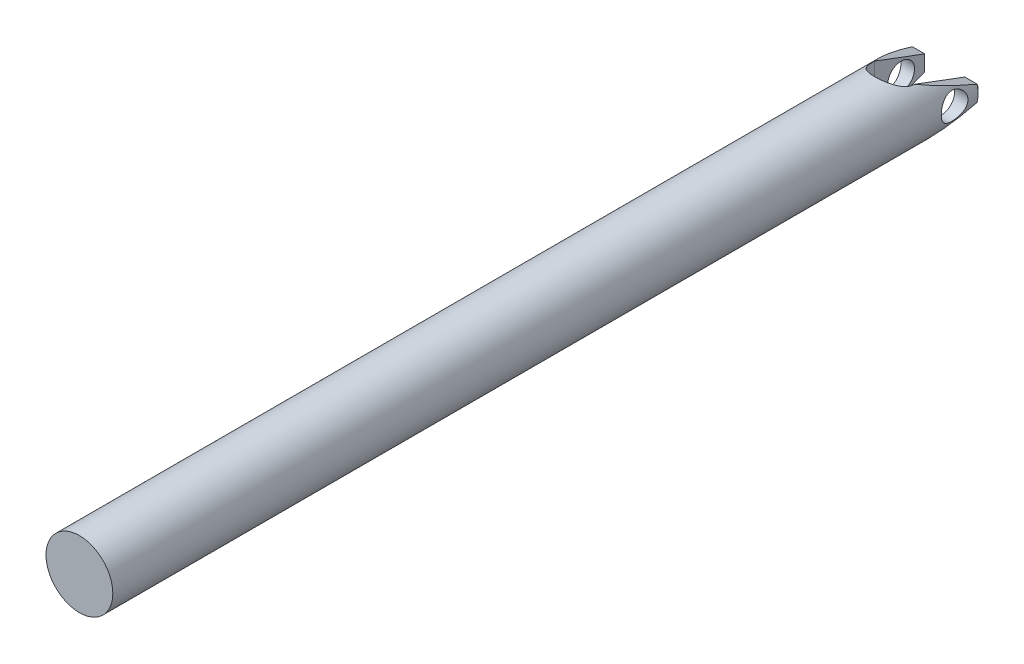
ISO-10303-21;
HEADER;
FILE_DESCRIPTION(('STEP AP214'),'2;1');
FILE_NAME('part.step','',(''),(''),'','','');
FILE_SCHEMA(('AUTOMOTIVE_DESIGN { 1 0 10303 214 1 1 1 1 }'));
ENDSEC;
DATA;
#1=APPLICATION_CONTEXT('core data for automotive mechanical design processes');
#2=APPLICATION_PROTOCOL_DEFINITION('international standard','automotive_design',2000,#1);
#3=PRODUCT_CONTEXT('',#1,'mechanical');
#4=PRODUCT('Part','Part','',(#3));
#5=PRODUCT_RELATED_PRODUCT_CATEGORY('part','',(#4));
#6=PRODUCT_DEFINITION_FORMATION('','',#4);
#7=PRODUCT_DEFINITION_CONTEXT('part definition',#1,'design');
#8=PRODUCT_DEFINITION('design','',#6,#7);
#9=PRODUCT_DEFINITION_SHAPE('','',#8);
#10=(LENGTH_UNIT() NAMED_UNIT(*) SI_UNIT(.MILLI.,.METRE.));
#11=(NAMED_UNIT(*) PLANE_ANGLE_UNIT() SI_UNIT($,.RADIAN.));
#12=(NAMED_UNIT(*) SI_UNIT($,.STERADIAN.) SOLID_ANGLE_UNIT());
#13=UNCERTAINTY_MEASURE_WITH_UNIT(LENGTH_MEASURE(1.E-05),#10,'distance_accuracy_value','');
#14=(GEOMETRIC_REPRESENTATION_CONTEXT(3) GLOBAL_UNCERTAINTY_ASSIGNED_CONTEXT((#13)) GLOBAL_UNIT_ASSIGNED_CONTEXT((#10,
#11,#12)) REPRESENTATION_CONTEXT('',''));
#15=CARTESIAN_POINT('',(0.,0.,0.));
#16=DIRECTION('',(0.,0.,1.));
#17=DIRECTION('',(1.,0.,0.));
#18=AXIS2_PLACEMENT_3D('',#15,#16,#17);
#19=CARTESIAN_POINT('',(0.,0.,0.));
#20=DIRECTION('',(0.,0.,1.));
#21=DIRECTION('',(1.,0.,0.));
#22=AXIS2_PLACEMENT_3D('',#19,#20,#21);
#23=PLANE('',#22);
#24=DIRECTION('',(0.,-1.,0.));
#25=VECTOR('',#24,1.);
#26=CARTESIAN_POINT('',(-3.5,0.,0.));
#27=LINE('',#26,#25);
#28=CARTESIAN_POINT('',(-3.5,0.5,0.));
#29=VERTEX_POINT('',#28);
#30=CARTESIAN_POINT('',(-3.5,-0.499999999999971,0.));
#31=VERTEX_POINT('',#30);
#32=EDGE_CURVE('E223',#29,#31,#27,.T.);
#33=ORIENTED_EDGE('',*,*,#32,.T.);
#34=DIRECTION('',(-1.,0.,0.));
#35=VECTOR('',#34,1.);
#36=CARTESIAN_POINT('',(0.,-0.499999999999971,0.));
#37=LINE('',#36,#35);
#38=CARTESIAN_POINT('',(-4.47213595499957,-0.499999999999971,0.));
#39=VERTEX_POINT('',#38);
#40=EDGE_CURVE('E225',#31,#39,#37,.T.);
#41=ORIENTED_EDGE('',*,*,#40,.T.);
#42=CARTESIAN_POINT('',(0.,0.,0.));
#43=DIRECTION('',(0.,0.,1.));
#44=DIRECTION('',(1.,0.,0.));
#45=AXIS2_PLACEMENT_3D('',#42,#43,#44);
#46=CIRCLE('',#45,4.49999999999999);
#47=CARTESIAN_POINT('',(-4.47213595499957,0.5,0.));
#48=VERTEX_POINT('',#47);
#49=EDGE_CURVE('E242',#39,#48,#46,.F.);
#50=ORIENTED_EDGE('',*,*,#49,.T.);
#51=DIRECTION('',(1.,0.,0.));
#52=VECTOR('',#51,1.);
#53=CARTESIAN_POINT('',(0.,0.5,0.));
#54=LINE('',#53,#52);
#55=EDGE_CURVE('E227',#48,#29,#54,.T.);
#56=ORIENTED_EDGE('',*,*,#55,.T.);
#57=EDGE_LOOP('',(#33,#41,#50,#56));
#58=FACE_BOUND('',#57,.T.);
#59=ADVANCED_FACE('F37',(#58),#23,.F.);
#60=CARTESIAN_POINT('',(0.,0.,130.));
#61=DIRECTION('',(0.,0.,-1.));
#62=DIRECTION('',(-1.,0.,0.));
#63=AXIS2_PLACEMENT_3D('',#60,#61,#62);
#64=CYLINDRICAL_SURFACE('',#63,5.);
#65=CARTESIAN_POINT('',(-5.,0.,2.));
#66=CARTESIAN_POINT('',(-4.99999271227085,0.107493005442891,2.00000985182373));
#67=CARTESIAN_POINT('',(-4.99649294306933,0.215172564090673,2.00871775208838));
#68=CARTESIAN_POINT('',(-4.98283453100642,0.427496480417895,2.04324770352124));
#69=CARTESIAN_POINT('',(-4.97265778698877,0.532131777561248,2.06911627908613));
#70=CARTESIAN_POINT('',(-4.94674209213119,0.734953922727402,2.13687607805883));
#71=CARTESIAN_POINT('',(-4.93102136364072,0.833160661616958,2.17871484621673));
#72=CARTESIAN_POINT('',(-4.89556610796078,1.02107197032837,2.27701917332655));
#73=CARTESIAN_POINT('',(-4.87583297458057,1.11077947675099,2.33347965491893));
#74=CARTESIAN_POINT('',(-4.83330886170419,1.28350100757039,2.46223549856094));
#75=CARTESIAN_POINT('',(-4.81042296929191,1.36606227255021,2.53510665624026));
#76=CARTESIAN_POINT('',(-4.76460576906195,1.51817500478472,2.69340000347678));
#77=CARTESIAN_POINT('',(-4.74167444453792,1.58772010713353,2.77882829721174));
#78=CARTESIAN_POINT('',(-4.69722791797136,1.71487456729288,2.96442807024227));
#79=CARTESIAN_POINT('',(-4.67582115964951,1.77181498119547,3.0650864860232));
#80=CARTESIAN_POINT('',(-4.63833647186793,1.86775471903715,3.27553639842004));
#81=CARTESIAN_POINT('',(-4.62225601244176,1.90676256428583,3.38532352784836));
#82=CARTESIAN_POINT('',(-4.59826357660819,1.96389882339587,3.6057123335921));
#83=CARTESIAN_POINT('',(-4.59001420355605,1.98289396580565,3.71605123557621));
#84=CARTESIAN_POINT('',(-4.58164004049144,2.00217296164003,3.93863499830727));
#85=CARTESIAN_POINT('',(-4.58151125522768,2.00246601631322,4.05087889462501));
#86=CARTESIAN_POINT('',(-4.58910500279994,1.98498936750454,4.26575667145804));
#87=CARTESIAN_POINT('',(-4.5962817503845,1.96847531430514,4.36851571440903));
#88=CARTESIAN_POINT('',(-4.61676187607836,1.91994688029782,4.56965955600671));
#89=CARTESIAN_POINT('',(-4.63006632321673,1.88792979480463,4.66804358811031));
#90=CARTESIAN_POINT('',(-4.6615948508853,1.80869473255107,4.86001783619604));
#91=CARTESIAN_POINT('',(-4.67991379280788,1.76117986231532,4.95346923905469));
#92=CARTESIAN_POINT('',(-4.7193811638989,1.65250646073221,5.13141581636156));
#93=CARTESIAN_POINT('',(-4.74053065456849,1.59134280510084,5.21590760940281));
#94=CARTESIAN_POINT('',(-4.78526736742271,1.45155059945443,5.380409728802));
#95=CARTESIAN_POINT('',(-4.80891664976152,1.37193746297064,5.45956872944602));
#96=CARTESIAN_POINT('',(-4.85459824958282,1.20031442743019,5.60368447800204));
#97=CARTESIAN_POINT('',(-4.87663024445325,1.10830206533443,5.66863839741029));
#98=CARTESIAN_POINT('',(-4.91714681264549,0.912077652605843,5.78361744741583));
#99=CARTESIAN_POINT('',(-4.93555270095415,0.807660491346477,5.83332228119705));
#100=CARTESIAN_POINT('',(-4.96614828328759,0.591023765482882,5.91416786107806));
#101=CARTESIAN_POINT('',(-4.97834113462382,0.478808196849674,5.94531803755741));
#102=CARTESIAN_POINT('',(-4.99456139506911,0.25689588760782,5.9864482954197));
#103=CARTESIAN_POINT('',(-4.99902945833514,0.147443293985535,5.99757245425356));
#104=CARTESIAN_POINT('',(-5.00068478510631,-0.0718453098078174,6.00171310052861));
#105=CARTESIAN_POINT('',(-4.99787393582292,-0.181681213223924,5.99473428154751));
#106=CARTESIAN_POINT('',(-4.98557567063753,-0.393432739121988,5.96370824744801));
#107=CARTESIAN_POINT('',(-4.97639391345523,-0.495482491775475,5.94044201964903));
#108=CARTESIAN_POINT('',(-4.952594414055,-0.694135428060781,5.87856429169019));
#109=CARTESIAN_POINT('',(-4.93797597356531,-0.790737910224845,5.83995082033132));
#110=CARTESIAN_POINT('',(-4.90416594770812,-0.979078785816702,5.74721506032005));
#111=CARTESIAN_POINT('',(-4.88484815979804,-1.07057802275541,5.69265452795685));
#112=CARTESIAN_POINT('',(-4.84373364745525,-1.24344359124656,5.57005967609436));
#113=CARTESIAN_POINT('',(-4.82193593110271,-1.32480584076113,5.50201995707739));
#114=CARTESIAN_POINT('',(-4.77645117638112,-1.48072304302882,5.34912998705037));
#115=CARTESIAN_POINT('',(-4.75273441425052,-1.55447393380606,5.26346645849379));
#116=CARTESIAN_POINT('',(-4.70741672917132,-1.68675119741371,5.08055991699063));
#117=CARTESIAN_POINT('',(-4.68581615526511,-1.74527506133751,4.98331499966005));
#118=CARTESIAN_POINT('',(-4.64714299907709,-1.84580750193163,4.7785383054059));
#119=CARTESIAN_POINT('',(-4.63011630884788,-1.88765059453445,4.67091600078769));
#120=CARTESIAN_POINT('',(-4.60323673477932,-1.9522962197053,4.44926634828485));
#121=CARTESIAN_POINT('',(-4.59337855695998,-1.97511280526932,4.33524379418758));
#122=CARTESIAN_POINT('',(-4.58271759299926,-1.9997156172784,4.11287209822546));
#123=CARTESIAN_POINT('',(-4.58131421008171,-2.00289708230287,4.00470516040665));
#124=CARTESIAN_POINT('',(-4.58614836033098,-1.99180315927753,3.78945514228671));
#125=CARTESIAN_POINT('',(-4.59238492324793,-1.97752998791378,3.68237192609742));
#126=CARTESIAN_POINT('',(-4.61126649079021,-1.93307136615365,3.47666781014496));
#127=CARTESIAN_POINT('',(-4.62364831827449,-1.90353749357098,3.377879725567));
#128=CARTESIAN_POINT('',(-4.65324001232697,-1.83000544849101,3.18662137038652));
#129=CARTESIAN_POINT('',(-4.67045121206007,-1.78600328139381,3.09415285310017));
#130=CARTESIAN_POINT('',(-4.70898609604491,-1.68187276275973,2.91239038072922));
#131=CARTESIAN_POINT('',(-4.73048882313242,-1.62096533515949,2.82358132986952));
#132=CARTESIAN_POINT('',(-4.77463804372237,-1.4858921192715,2.65700668279624));
#133=CARTESIAN_POINT('',(-4.79728488048406,-1.41172233481812,2.57924442787169));
#134=CARTESIAN_POINT('',(-4.84293567087394,-1.24650550627246,2.43179714673639));
#135=CARTESIAN_POINT('',(-4.86586757962185,-1.15467600114614,2.36296269310193));
#136=CARTESIAN_POINT('',(-4.90800406713717,-0.959900320285781,2.24166295737837));
#137=CARTESIAN_POINT('',(-4.92720691092906,-0.856949004547239,2.18920528784747));
#138=CARTESIAN_POINT('',(-4.95939714815861,-0.644738062495205,2.10337778480971));
#139=CARTESIAN_POINT('',(-4.97249363055028,-0.535631618219697,2.06967067643966));
#140=CARTESIAN_POINT('',(-4.99144306209366,-0.312876546281222,2.02136087904573));
#141=CARTESIAN_POINT('',(-4.99731899495638,-0.199243525858914,2.0066975632561));
#142=CARTESIAN_POINT('',(-4.99975899504137,-0.0569122978909306,2.00060461902173));
#143=CARTESIAN_POINT('',(-5.00000192969176,-0.0284626887407591,1.9999973913708));
#144=CARTESIAN_POINT('',(-5.,0.,2.));
#145=B_SPLINE_CURVE_WITH_KNOTS('',3,(#65,#66,#67,#68,#69,#70,#71,#72,#73,#74,#75,#76,#77,#78,
#79,#80,#81,#82,#83,#84,#85,#86,#87,#88,#89,#90,#91,#92,#93,#94,#95,#96,#97,#98,#99,#100,#101,
#102,#103,#104,#105,#106,#107,#108,#109,#110,#111,#112,#113,#114,#115,#116,#117,#118,#119,#120,
#121,#122,#123,#124,#125,#126,#127,#128,#129,#130,#131,#132,#133,#134,#135,#136,#137,#138,#139,
#140,#141,#142,#143,#144),.UNSPECIFIED.,.T.,.F.,(4,2,2,2,2,2,2,2,2,2,2,2,2,2,2,2,2,2,2,2,2,2,2,
2,2,2,2,2,2,2,2,2,2,2,2,2,2,2,2,4),(0.,0.322402987893071,0.645683636007934,0.967911457471581,
1.29002753567984,1.62597381700397,1.96208394934411,2.31315258819217,2.66405423118268,
2.99904105308829,3.33386306340488,3.64538328401372,3.95695787256047,4.27489126298816,
4.59294421938183,4.93558349186557,5.27829092839733,5.62776913162806,5.9770695611379,
6.30569184528007,6.63422893570082,6.94800455564366,7.26182048993797,7.58523513398263,
7.90877959498969,8.25368474624414,8.59864669043748,8.94695045140827,9.29499672645934,
9.61799673392748,9.94095572563046,10.2511431854877,10.5614163580516,10.8894546805669,
11.2175920134839,11.5670042353384,11.9165786364053,12.2596430101332,12.6016125240434,
12.686980458968),.UNSPECIFIED.);
#146=CARTESIAN_POINT('',(-5.,0.,2.));
#147=VERTEX_POINT('',#146);
#148=EDGE_CURVE('E180',#147,#147,#145,.T.);
#149=ORIENTED_EDGE('',*,*,#148,.T.);
#150=EDGE_LOOP('',(#149));
#151=FACE_BOUND('',#150,.T.);
#152=CARTESIAN_POINT('',(5.,0.,2.));
#153=CARTESIAN_POINT('',(4.99999271227085,-0.107493005442891,2.00000985182373));
#154=CARTESIAN_POINT('',(4.99649294306933,-0.215172564090673,2.00871775208838));
#155=CARTESIAN_POINT('',(4.98283453100642,-0.427496480417896,2.04324770352124));
#156=CARTESIAN_POINT('',(4.97265778698877,-0.532131777561248,2.06911627908613));
#157=CARTESIAN_POINT('',(4.94674209213119,-0.734953922727403,2.13687607805883));
#158=CARTESIAN_POINT('',(4.93102136364072,-0.833160661616959,2.17871484621673));
#159=CARTESIAN_POINT('',(4.89556610796078,-1.02107197032837,2.27701917332655));
#160=CARTESIAN_POINT('',(4.87583297458057,-1.11077947675099,2.33347965491893));
#161=CARTESIAN_POINT('',(4.83330886170419,-1.28350100757039,2.46223549856094));
#162=CARTESIAN_POINT('',(4.81042296929191,-1.36606227255021,2.53510665624026));
#163=CARTESIAN_POINT('',(4.76460576906195,-1.51817500478472,2.69340000347678));
#164=CARTESIAN_POINT('',(4.74167444453792,-1.58772010713353,2.77882829721174));
#165=CARTESIAN_POINT('',(4.69722791797136,-1.71487456729288,2.96442807024227));
#166=CARTESIAN_POINT('',(4.67582115964951,-1.77181498119547,3.0650864860232));
#167=CARTESIAN_POINT('',(4.63833647186793,-1.86775471903715,3.27553639842004));
#168=CARTESIAN_POINT('',(4.62225601244176,-1.90676256428584,3.38532352784836));
#169=CARTESIAN_POINT('',(4.59826357660819,-1.96389882339587,3.6057123335921));
#170=CARTESIAN_POINT('',(4.59001420355605,-1.98289396580565,3.71605123557621));
#171=CARTESIAN_POINT('',(4.58164004049144,-2.00217296164003,3.93863499830727));
#172=CARTESIAN_POINT('',(4.58151125522768,-2.00246601631322,4.05087889462501));
#173=CARTESIAN_POINT('',(4.58910500279994,-1.98498936750454,4.26575667145804));
#174=CARTESIAN_POINT('',(4.5962817503845,-1.96847531430514,4.36851571440903));
#175=CARTESIAN_POINT('',(4.61676187607836,-1.91994688029782,4.56965955600671));
#176=CARTESIAN_POINT('',(4.63006632321673,-1.88792979480463,4.66804358811031));
#177=CARTESIAN_POINT('',(4.6615948508853,-1.80869473255107,4.86001783619604));
#178=CARTESIAN_POINT('',(4.67991379280788,-1.76117986231532,4.95346923905469));
#179=CARTESIAN_POINT('',(4.7193811638989,-1.65250646073221,5.13141581636156));
#180=CARTESIAN_POINT('',(4.74053065456849,-1.59134280510084,5.21590760940281));
#181=CARTESIAN_POINT('',(4.78526736742271,-1.45155059945443,5.380409728802));
#182=CARTESIAN_POINT('',(4.80891664976152,-1.37193746297064,5.45956872944602));
#183=CARTESIAN_POINT('',(4.85459824958282,-1.20031442743019,5.60368447800204));
#184=CARTESIAN_POINT('',(4.87663024445325,-1.10830206533443,5.66863839741029));
#185=CARTESIAN_POINT('',(4.91714681264548,-0.912077652605844,5.78361744741583));
#186=CARTESIAN_POINT('',(4.93555270095415,-0.807660491346478,5.83332228119705));
#187=CARTESIAN_POINT('',(4.96614828328759,-0.591023765482883,5.91416786107806));
#188=CARTESIAN_POINT('',(4.97834113462382,-0.478808196849675,5.94531803755741));
#189=CARTESIAN_POINT('',(4.99456139506911,-0.256895887607822,5.9864482954197));
#190=CARTESIAN_POINT('',(4.99902945833514,-0.147443293985536,5.99757245425356));
#191=CARTESIAN_POINT('',(5.00068478510631,0.0718453098078155,6.00171310052861));
#192=CARTESIAN_POINT('',(4.99787393582292,0.181681213223922,5.99473428154751));
#193=CARTESIAN_POINT('',(4.98557567063753,0.393432739121986,5.96370824744801));
#194=CARTESIAN_POINT('',(4.97639391345523,0.495482491775474,5.94044201964903));
#195=CARTESIAN_POINT('',(4.952594414055,0.694135428060779,5.87856429169019));
#196=CARTESIAN_POINT('',(4.93797597356531,0.790737910224844,5.83995082033132));
#197=CARTESIAN_POINT('',(4.90416594770812,0.979078785816701,5.74721506032005));
#198=CARTESIAN_POINT('',(4.88484815979804,1.07057802275541,5.69265452795685));
#199=CARTESIAN_POINT('',(4.84373364745525,1.24344359124655,5.57005967609436));
#200=CARTESIAN_POINT('',(4.82193593110271,1.32480584076112,5.50201995707739));
#201=CARTESIAN_POINT('',(4.77645117638112,1.48072304302882,5.34912998705037));
#202=CARTESIAN_POINT('',(4.75273441425052,1.55447393380606,5.26346645849379));
#203=CARTESIAN_POINT('',(4.70741672917132,1.68675119741371,5.08055991699063));
#204=CARTESIAN_POINT('',(4.68581615526511,1.74527506133751,4.98331499966005));
#205=CARTESIAN_POINT('',(4.64714299907709,1.84580750193163,4.7785383054059));
#206=CARTESIAN_POINT('',(4.63011630884788,1.88765059453445,4.67091600078769));
#207=CARTESIAN_POINT('',(4.60323673477932,1.9522962197053,4.44926634828485));
#208=CARTESIAN_POINT('',(4.59337855695998,1.97511280526932,4.33524379418757));
#209=CARTESIAN_POINT('',(4.58271759299926,1.9997156172784,4.11287209822546));
#210=CARTESIAN_POINT('',(4.58131421008172,2.00289708230287,4.00470516040665));
#211=CARTESIAN_POINT('',(4.58614836033098,1.99180315927752,3.78945514228671));
#212=CARTESIAN_POINT('',(4.59238492324794,1.97752998791378,3.68237192609742));
#213=CARTESIAN_POINT('',(4.61126649079021,1.93307136615365,3.47666781014496));
#214=CARTESIAN_POINT('',(4.62364831827449,1.90353749357098,3.377879725567));
#215=CARTESIAN_POINT('',(4.65324001232697,1.83000544849101,3.18662137038652));
#216=CARTESIAN_POINT('',(4.67045121206007,1.78600328139381,3.09415285310017));
#217=CARTESIAN_POINT('',(4.70898609604492,1.68187276275973,2.91239038072922));
#218=CARTESIAN_POINT('',(4.73048882313242,1.62096533515949,2.82358132986952));
#219=CARTESIAN_POINT('',(4.77463804372237,1.4858921192715,2.65700668279624));
#220=CARTESIAN_POINT('',(4.79728488048407,1.41172233481812,2.57924442787168));
#221=CARTESIAN_POINT('',(4.84293567087394,1.24650550627246,2.43179714673639));
#222=CARTESIAN_POINT('',(4.86586757962185,1.15467600114614,2.36296269310193));
#223=CARTESIAN_POINT('',(4.90800406713717,0.959900320285779,2.24166295737836));
#224=CARTESIAN_POINT('',(4.92720691092906,0.856949004547237,2.18920528784747));
#225=CARTESIAN_POINT('',(4.95939714815861,0.644738062495202,2.10337778480971));
#226=CARTESIAN_POINT('',(4.97249363055028,0.535631618219695,2.06967067643966));
#227=CARTESIAN_POINT('',(4.99144306209366,0.31287654628122,2.02136087904573));
#228=CARTESIAN_POINT('',(4.99731899495638,0.199243525858912,2.0066975632561));
#229=CARTESIAN_POINT('',(4.99975899504137,0.0569122978909296,2.00060461902173));
#230=CARTESIAN_POINT('',(5.00000192969176,0.0284626887407583,1.9999973913708));
#231=CARTESIAN_POINT('',(5.,0.,2.));
#232=B_SPLINE_CURVE_WITH_KNOTS('',3,(#152,#153,#154,#155,#156,#157,#158,#159,#160,#161,#162,
#163,#164,#165,#166,#167,#168,#169,#170,#171,#172,#173,#174,#175,#176,#177,#178,#179,#180,#181,
#182,#183,#184,#185,#186,#187,#188,#189,#190,#191,#192,#193,#194,#195,#196,#197,#198,#199,#200,
#201,#202,#203,#204,#205,#206,#207,#208,#209,#210,#211,#212,#213,#214,#215,#216,#217,#218,#219,
#220,#221,#222,#223,#224,#225,#226,#227,#228,#229,#230,#231),.UNSPECIFIED.,.T.,.F.,(4,2,2,2,2,2,
2,2,2,2,2,2,2,2,2,2,2,2,2,2,2,2,2,2,2,2,2,2,2,2,2,2,2,2,2,2,2,2,2,4),(0.,0.322402987893071,
0.645683636007934,0.967911457471581,1.29002753567984,1.62597381700397,1.96208394934411,
2.31315258819217,2.66405423118268,2.99904105308829,3.33386306340488,3.64538328401372,
3.95695787256047,4.27489126298816,4.59294421938183,4.93558349186557,5.27829092839733,
5.62776913162806,5.9770695611379,6.30569184528007,6.63422893570082,6.94800455564366,
7.26182048993797,7.58523513398263,7.90877959498969,8.25368474624414,8.59864669043748,
8.94695045140828,9.29499672645934,9.61799673392748,9.94095572563046,10.2511431854877,
10.5614163580516,10.8894546805669,11.2175920134839,11.5670042353384,11.9165786364053,
12.2596430101332,12.6016125240434,12.686980458968),.UNSPECIFIED.);
#233=CARTESIAN_POINT('',(5.,0.,2.));
#234=VERTEX_POINT('',#233);
#235=EDGE_CURVE('E352',#234,#234,#232,.T.);
#236=ORIENTED_EDGE('',*,*,#235,.T.);
#237=EDGE_LOOP('',(#236));
#238=FACE_BOUND('',#237,.T.);
#239=CARTESIAN_POINT('',(0.,0.,130.));
#240=DIRECTION('',(0.,0.,1.));
#241=DIRECTION('',(1.,0.,0.));
#242=AXIS2_PLACEMENT_3D('',#239,#240,#241);
#243=CIRCLE('',#242,5.);
#244=CARTESIAN_POINT('',(5.,0.,130.));
#245=VERTEX_POINT('',#244);
#246=EDGE_CURVE('E176',#245,#245,#243,.T.);
#247=ORIENTED_EDGE('',*,*,#246,.F.);
#248=EDGE_LOOP('',(#247));
#249=FACE_BOUND('',#248,.T.);
#250=CARTESIAN_POINT('',(0.,0.,-2.66666666666665));
#251=DIRECTION('',(0.,-0.936329177569044,0.351123441588392));
#252=DIRECTION('',(0.,-0.351123441588392,-0.936329177569044));
#253=AXIS2_PLACEMENT_3D('',#250,#251,#252);
#254=ELLIPSE('',#253,14.2400062421959,5.);
#255=CARTESIAN_POINT('',(-3.,4.,8.));
#256=VERTEX_POINT('',#255);
#257=CARTESIAN_POINT('',(-4.85693769262073,1.1875,0.500000000000018));
#258=VERTEX_POINT('',#257);
#259=EDGE_CURVE('E348',#256,#258,#254,.T.);
#260=ORIENTED_EDGE('',*,*,#259,.T.);
#261=CARTESIAN_POINT('',(0.,0.,0.500000000000028));
#262=DIRECTION('',(0.,0.,1.));
#263=DIRECTION('',(1.,0.,0.));
#264=AXIS2_PLACEMENT_3D('',#261,#262,#263);
#265=CIRCLE('',#264,5.);
#266=CARTESIAN_POINT('',(-4.85693769262073,-1.1875,0.50000000000002));
#267=VERTEX_POINT('',#266);
#268=EDGE_CURVE('E144',#258,#267,#265,.T.);
#269=ORIENTED_EDGE('',*,*,#268,.T.);
#270=CARTESIAN_POINT('',(0.,0.,-2.66666666666665));
#271=DIRECTION('',(0.,0.936329177569044,0.351123441588392));
#272=DIRECTION('',(0.,0.351123441588392,-0.936329177569044));
#273=AXIS2_PLACEMENT_3D('',#270,#271,#272);
#274=ELLIPSE('',#273,14.2400062421959,5.);
#275=CARTESIAN_POINT('',(-3.,-4.,8.));
#276=VERTEX_POINT('',#275);
#277=EDGE_CURVE('E136',#267,#276,#274,.T.);
#278=ORIENTED_EDGE('',*,*,#277,.T.);
#279=CARTESIAN_POINT('',(-3.,-4.,8.));
#280=CARTESIAN_POINT('',(-3.00001692537307,-3.99996787232582,8.07587197781658));
#281=CARTESIAN_POINT('',(-2.99712241547426,-4.00215786299425,8.1517250779009));
#282=CARTESIAN_POINT('',(-2.98564518053647,-4.01073748214673,8.30268877604343));
#283=CARTESIAN_POINT('',(-2.97706800024636,-4.01712301686455,8.3778000255142));
#284=CARTESIAN_POINT('',(-2.95445046977405,-4.03378307190143,8.5261296691882));
#285=CARTESIAN_POINT('',(-2.9404543893273,-4.04402606066036,8.59935840101787));
#286=CARTESIAN_POINT('',(-2.90722136348392,-4.06798283405873,8.74402847274264));
#287=CARTESIAN_POINT('',(-2.88798336524856,-4.0816973159079,8.81546945041679));
#288=CARTESIAN_POINT('',(-2.8229314582683,-4.12720949885209,9.02592970004444));
#289=CARTESIAN_POINT('',(-2.76967363516867,-4.16345930010658,9.16176117917723));
#290=CARTESIAN_POINT('',(-2.64519536397734,-4.24363256758645,9.42265250866881));
#291=CARTESIAN_POINT('',(-2.57393414481207,-4.28757338079438,9.54768703372599));
#292=CARTESIAN_POINT('',(-2.40540739276781,-4.38458187114305,9.79991707373727));
#293=CARTESIAN_POINT('',(-2.30603538494307,-4.43810998768876,9.92553283902476));
#294=CARTESIAN_POINT('',(-2.08849836637956,-4.54454402644166,10.1595709711291));
#295=CARTESIAN_POINT('',(-1.97032662842432,-4.59744971861748,10.2679871554789));
#296=CARTESIAN_POINT('',(-1.70284992270617,-4.70351635584217,10.4762784779573));
#297=CARTESIAN_POINT('',(-1.55155989155464,-4.75608571502877,10.5739607221093));
#298=CARTESIAN_POINT('',(-1.31133584893003,-4.82570253754456,10.6997410602051));
#299=CARTESIAN_POINT('',(-1.22901675253547,-4.84737427703644,10.7382200091952));
#300=CARTESIAN_POINT('',(-1.06047705712918,-4.88700901757081,10.8077891972526));
#301=CARTESIAN_POINT('',(-0.974259084161879,-4.90497447088308,10.8388843239077));
#302=CARTESIAN_POINT('',(-0.80696811114492,-4.93511192382809,10.8906274411337));
#303=CARTESIAN_POINT('',(-0.726184333286255,-4.94767213737429,10.9119872265863));
#304=CARTESIAN_POINT('',(-0.562666702523369,-4.96892319630847,10.9479498900931));
#305=CARTESIAN_POINT('',(-0.479933963388205,-4.97761619778881,10.9625565334154));
#306=CARTESIAN_POINT('',(-0.31324506739516,-4.99087752212245,10.9847846401799));
#307=CARTESIAN_POINT('',(-0.229289584910363,-4.99544803715671,10.9924098161327));
#308=CARTESIAN_POINT('',(-0.0609399693770663,-5.00033941568446,11.0005666399651));
#309=CARTESIAN_POINT('',(0.0234541181691724,-5.00066071153612,11.001099009538));
#310=CARTESIAN_POINT('',(0.255171482719202,-4.99565269254161,10.9927571983106));
#311=CARTESIAN_POINT('',(0.402220564293305,-4.98590474727508,10.976528740899));
#312=CARTESIAN_POINT('',(0.690956802634009,-4.95416382666838,10.9230444006394));
#313=CARTESIAN_POINT('',(0.832643583305876,-4.93216999413411,10.8857870457968));
#314=CARTESIAN_POINT('',(1.10810810538678,-4.87769664946882,10.791666925357));
#315=CARTESIAN_POINT('',(1.24183502003439,-4.8451568590039,10.73469132452));
#316=CARTESIAN_POINT('',(1.49798262201563,-4.77219201218867,10.6032295537245));
#317=CARTESIAN_POINT('',(1.62040068646819,-4.73176513330436,10.5287393357024));
#318=CARTESIAN_POINT('',(1.86613229963393,-4.64076401053392,10.3543308526364));
#319=CARTESIAN_POINT('',(1.98780984018439,-4.5895545518581,10.2524390608162));
#320=CARTESIAN_POINT('',(2.21339922400099,-4.48512684863209,10.0312325666845));
#321=CARTESIAN_POINT('',(2.31728198187349,-4.43190548570084,9.91188992018527));
#322=CARTESIAN_POINT('',(2.5165997199067,-4.322164352034,9.64253202394931));
#323=CARTESIAN_POINT('',(2.60963495464279,-4.26598422797724,9.4905626715682));
#324=CARTESIAN_POINT('',(2.72853585268935,-4.1901448347924,9.25022885219442));
#325=CARTESIAN_POINT('',(2.76470247721435,-4.16628916905457,9.16813958766857));
#326=CARTESIAN_POINT('',(2.82979053218026,-4.12235655723053,9.0001887992641));
#327=CARTESIAN_POINT('',(2.8587179039267,-4.10227651585106,8.91433043719178));
#328=CARTESIAN_POINT('',(2.90274028553152,-4.07119612829703,8.76080841158084));
#329=CARTESIAN_POINT('',(2.91948814079959,-4.05917589940332,8.69381945435067));
#330=CARTESIAN_POINT('',(2.94838741026761,-4.03823334849025,8.55839319475917));
#331=CARTESIAN_POINT('',(2.96054034014789,-4.02931000501334,8.48995637786772));
#332=CARTESIAN_POINT('',(2.9801517937935,-4.0148292966003,8.35157621963731));
#333=CARTESIAN_POINT('',(2.98757781123641,-4.00929524901473,8.28162579579692));
#334=CARTESIAN_POINT('',(2.99751072442895,-4.00186666189432,8.14112148517981));
#335=CARTESIAN_POINT('',(3.00001307471461,-3.99997548544344,8.07056710111613));
#336=CARTESIAN_POINT('',(3.,-4.,8.));
#337=B_SPLINE_CURVE_WITH_KNOTS('',3,(#279,#280,#281,#282,#283,#284,#285,#286,#287,#288,#289,
#290,#291,#292,#293,#294,#295,#296,#297,#298,#299,#300,#301,#302,#303,#304,#305,#306,#307,#308,
#309,#310,#311,#312,#313,#314,#315,#316,#317,#318,#319,#320,#321,#322,#323,#324,#325,#326,#327,
#328,#329,#330,#331,#332,#333,#334,#335,#336),.UNSPECIFIED.,.F.,.F.,(4,2,2,2,2,2,2,2,2,2,2,2,2,
2,2,2,2,2,2,2,2,2,2,2,2,2,2,2,4),(0.,0.227498555850967,0.454775460929313,0.680233524310974,
0.905736904347183,1.35470516337821,1.80469943008079,2.30931246709203,2.81410648055545,
3.37351129512612,3.65339988736764,3.93310269272289,4.18623678333959,4.43922956632184,
4.69208773794773,4.94492018104929,5.38737462629134,5.82986004658815,6.27492058766907,
6.7200840946005,7.21836387040733,7.71745046525489,8.27476706024815,8.55288821458631,
8.83078035880877,9.04083694509353,9.25082418161801,9.46224029964901,9.67385150282052),.UNSPECIFIED.);
#338=CARTESIAN_POINT('',(3.,-4.,8.));
#339=VERTEX_POINT('',#338);
#340=EDGE_CURVE('E142',#276,#339,#337,.T.);
#341=ORIENTED_EDGE('',*,*,#340,.T.);
#342=CARTESIAN_POINT('',(4.85693769262073,-1.1875,0.500000000000018));
#343=VERTEX_POINT('',#342);
#344=EDGE_CURVE('E150',#339,#343,#274,.T.);
#345=ORIENTED_EDGE('',*,*,#344,.T.);
#346=CARTESIAN_POINT('',(0.,0.,0.500000000000028));
#347=DIRECTION('',(0.,0.,1.));
#348=DIRECTION('',(1.,0.,0.));
#349=AXIS2_PLACEMENT_3D('',#346,#347,#348);
#350=CIRCLE('',#349,5.);
#351=CARTESIAN_POINT('',(4.85693769262073,1.1875,0.500000000000023));
#352=VERTEX_POINT('',#351);
#353=EDGE_CURVE('E241',#343,#352,#350,.T.);
#354=ORIENTED_EDGE('',*,*,#353,.T.);
#355=CARTESIAN_POINT('',(3.,4.,8.));
#356=VERTEX_POINT('',#355);
#357=EDGE_CURVE('E147',#352,#356,#254,.T.);
#358=ORIENTED_EDGE('',*,*,#357,.T.);
#359=CARTESIAN_POINT('',(3.,4.,8.));
#360=CARTESIAN_POINT('',(3.00001692537307,3.99996787232583,8.07587197781658));
#361=CARTESIAN_POINT('',(2.99712241547426,4.00215786299426,8.1517250779009));
#362=CARTESIAN_POINT('',(2.98564518053647,4.01073748214673,8.30268877604343));
#363=CARTESIAN_POINT('',(2.97706800024636,4.01712301686455,8.3778000255142));
#364=CARTESIAN_POINT('',(2.95445046977405,4.03378307190143,8.5261296691882));
#365=CARTESIAN_POINT('',(2.94045438932729,4.04402606066036,8.59935840101787));
#366=CARTESIAN_POINT('',(2.90722136348392,4.06798283405873,8.74402847274264));
#367=CARTESIAN_POINT('',(2.88798336524856,4.0816973159079,8.81546945041679));
#368=CARTESIAN_POINT('',(2.8229314582683,4.12720949885209,9.02592970004444));
#369=CARTESIAN_POINT('',(2.76967363516867,4.16345930010658,9.16176117917724));
#370=CARTESIAN_POINT('',(2.64519536397733,4.24363256758645,9.42265250866881));
#371=CARTESIAN_POINT('',(2.57393414481207,4.28757338079438,9.54768703372599));
#372=CARTESIAN_POINT('',(2.40540739276781,4.38458187114305,9.79991707373727));
#373=CARTESIAN_POINT('',(2.30603538494306,4.43810998768876,9.92553283902476));
#374=CARTESIAN_POINT('',(2.08849836637956,4.54454402644166,10.1595709711291));
#375=CARTESIAN_POINT('',(1.97032662842432,4.59744971861748,10.2679871554789));
#376=CARTESIAN_POINT('',(1.70284992270617,4.70351635584217,10.4762784779573));
#377=CARTESIAN_POINT('',(1.55155989155464,4.75608571502877,10.5739607221093));
#378=CARTESIAN_POINT('',(1.31133584893003,4.82570253754456,10.6997410602051));
#379=CARTESIAN_POINT('',(1.22901675253547,4.84737427703644,10.7382200091952));
#380=CARTESIAN_POINT('',(1.06047705712917,4.88700901757081,10.8077891972526));
#381=CARTESIAN_POINT('',(0.974259084161876,4.90497447088308,10.8388843239077));
#382=CARTESIAN_POINT('',(0.806968111144918,4.93511192382809,10.8906274411337));
#383=CARTESIAN_POINT('',(0.726184333286253,4.94767213737429,10.9119872265863));
#384=CARTESIAN_POINT('',(0.562666702523368,4.96892319630847,10.9479498900931));
#385=CARTESIAN_POINT('',(0.479933963388204,4.97761619778881,10.9625565334154));
#386=CARTESIAN_POINT('',(0.313245067395158,4.99087752212245,10.9847846401799));
#387=CARTESIAN_POINT('',(0.229289584910361,4.99544803715671,10.9924098161327));
#388=CARTESIAN_POINT('',(0.0609399693770649,5.00033941568446,11.0005666399651));
#389=CARTESIAN_POINT('',(-0.0234541181691739,5.00066071153612,11.001099009538));
#390=CARTESIAN_POINT('',(-0.255171482719204,4.99565269254161,10.9927571983106));
#391=CARTESIAN_POINT('',(-0.402220564293307,4.98590474727508,10.976528740899));
#392=CARTESIAN_POINT('',(-0.690956802634011,4.95416382666838,10.9230444006394));
#393=CARTESIAN_POINT('',(-0.832643583305877,4.93216999413411,10.8857870457968));
#394=CARTESIAN_POINT('',(-1.10810810538678,4.87769664946882,10.791666925357));
#395=CARTESIAN_POINT('',(-1.24183502003439,4.8451568590039,10.73469132452));
#396=CARTESIAN_POINT('',(-1.49798262201564,4.77219201218866,10.6032295537245));
#397=CARTESIAN_POINT('',(-1.62040068646819,4.73176513330436,10.5287393357024));
#398=CARTESIAN_POINT('',(-1.86613229963393,4.64076401053392,10.3543308526364));
#399=CARTESIAN_POINT('',(-1.98780984018439,4.5895545518581,10.2524390608162));
#400=CARTESIAN_POINT('',(-2.21339922400099,4.48512684863209,10.0312325666845));
#401=CARTESIAN_POINT('',(-2.31728198187349,4.43190548570084,9.91188992018527));
#402=CARTESIAN_POINT('',(-2.5165997199067,4.322164352034,9.64253202394931));
#403=CARTESIAN_POINT('',(-2.60963495464279,4.26598422797724,9.4905626715682));
#404=CARTESIAN_POINT('',(-2.72853585268935,4.1901448347924,9.25022885219442));
#405=CARTESIAN_POINT('',(-2.76470247721435,4.16628916905457,9.16813958766857));
#406=CARTESIAN_POINT('',(-2.82979053218026,4.12235655723053,9.00018879926409));
#407=CARTESIAN_POINT('',(-2.8587179039267,4.10227651585106,8.91433043719178));
#408=CARTESIAN_POINT('',(-2.90274028553153,4.07119612829703,8.76080841158084));
#409=CARTESIAN_POINT('',(-2.91948814079959,4.05917589940332,8.69381945435067));
#410=CARTESIAN_POINT('',(-2.94838741026761,4.03823334849025,8.55839319475917));
#411=CARTESIAN_POINT('',(-2.96054034014789,4.02931000501334,8.48995637786772));
#412=CARTESIAN_POINT('',(-2.9801517937935,4.0148292966003,8.35157621963731));
#413=CARTESIAN_POINT('',(-2.98757781123642,4.00929524901473,8.28162579579692));
#414=CARTESIAN_POINT('',(-2.99751072442895,4.00186666189432,8.14112148517981));
#415=CARTESIAN_POINT('',(-3.00001307471461,3.99997548544344,8.07056710111613));
#416=CARTESIAN_POINT('',(-3.,4.,8.));
#417=B_SPLINE_CURVE_WITH_KNOTS('',3,(#359,#360,#361,#362,#363,#364,#365,#366,#367,#368,#369,
#370,#371,#372,#373,#374,#375,#376,#377,#378,#379,#380,#381,#382,#383,#384,#385,#386,#387,#388,
#389,#390,#391,#392,#393,#394,#395,#396,#397,#398,#399,#400,#401,#402,#403,#404,#405,#406,#407,
#408,#409,#410,#411,#412,#413,#414,#415,#416),.UNSPECIFIED.,.F.,.F.,(4,2,2,2,2,2,2,2,2,2,2,2,2,
2,2,2,2,2,2,2,2,2,2,2,2,2,2,2,4),(0.,0.227498555850967,0.454775460929315,0.680233524310974,
0.905736904347183,1.35470516337822,1.80469943008079,2.30931246709203,2.81410648055545,
3.37351129512612,3.65339988736764,3.93310269272289,4.18623678333959,4.43922956632184,
4.69208773794773,4.94492018104929,5.38737462629134,5.82986004658815,6.27492058766907,
6.7200840946005,7.21836387040733,7.71745046525489,8.27476706024815,8.55288821458631,
8.83078035880877,9.04083694509353,9.25082418161801,9.462240299649,9.67385150282052),.UNSPECIFIED.);
#418=EDGE_CURVE('E170',#356,#256,#417,.T.);
#419=ORIENTED_EDGE('',*,*,#418,.T.);
#420=EDGE_LOOP('',(#260,#269,#278,#341,#345,#354,#358,#419));
#421=FACE_BOUND('',#420,.T.);
#422=ADVANCED_FACE('F139',(#151,#238,#249,#421),#64,.T.);
#423=CARTESIAN_POINT('',(0.,0.,130.));
#424=DIRECTION('',(0.,0.,1.));
#425=DIRECTION('',(1.,0.,0.));
#426=AXIS2_PLACEMENT_3D('',#423,#424,#425);
#427=PLANE('',#426);
#428=ORIENTED_EDGE('',*,*,#246,.T.);
#429=EDGE_LOOP('',(#428));
#430=FACE_BOUND('',#429,.T.);
#431=ADVANCED_FACE('F207',(#430),#427,.T.);
#432=DIRECTION('',(-1.,0.,0.));
#433=VECTOR('',#432,1.);
#434=CARTESIAN_POINT('',(0.,-0.499999999999971,0.));
#435=LINE('',#434,#433);
#436=CARTESIAN_POINT('',(4.47213595499957,-0.499999999999971,0.));
#437=VERTEX_POINT('',#436);
#438=CARTESIAN_POINT('',(3.5,-0.499999999999971,0.));
#439=VERTEX_POINT('',#438);
#440=EDGE_CURVE('E278',#437,#439,#435,.T.);
#441=ORIENTED_EDGE('',*,*,#440,.T.);
#442=DIRECTION('',(0.,1.,0.));
#443=VECTOR('',#442,1.);
#444=CARTESIAN_POINT('',(3.5,0.,0.));
#445=LINE('',#444,#443);
#446=CARTESIAN_POINT('',(3.5,0.5,0.));
#447=VERTEX_POINT('',#446);
#448=EDGE_CURVE('E280',#439,#447,#445,.T.);
#449=ORIENTED_EDGE('',*,*,#448,.T.);
#450=DIRECTION('',(1.,0.,0.));
#451=VECTOR('',#450,1.);
#452=CARTESIAN_POINT('',(0.,0.5,0.));
#453=LINE('',#452,#451);
#454=CARTESIAN_POINT('',(4.47213595499957,0.5,0.));
#455=VERTEX_POINT('',#454);
#456=EDGE_CURVE('E267',#447,#455,#453,.T.);
#457=ORIENTED_EDGE('',*,*,#456,.T.);
#458=CARTESIAN_POINT('',(0.,0.,0.));
#459=DIRECTION('',(0.,0.,1.));
#460=DIRECTION('',(1.,0.,0.));
#461=AXIS2_PLACEMENT_3D('',#458,#459,#460);
#462=CIRCLE('',#461,4.49999999999999);
#463=EDGE_CURVE('E276',#455,#437,#462,.F.);
#464=ORIENTED_EDGE('',*,*,#463,.T.);
#465=EDGE_LOOP('',(#441,#449,#457,#464));
#466=FACE_BOUND('',#465,.T.);
#467=ADVANCED_FACE('F204',(#466),#23,.F.);
#468=CARTESIAN_POINT('',(0.,-5.,8.));
#469=DIRECTION('',(0.,1.,0.));
#470=DIRECTION('',(0.,0.,1.));
#471=AXIS2_PLACEMENT_3D('',#468,#469,#470);
#472=CYLINDRICAL_SURFACE('',#471,3.);
#473=DIRECTION('',(0.,1.,0.));
#474=VECTOR('',#473,1.);
#475=CARTESIAN_POINT('',(3.,-5.,8.));
#476=LINE('',#475,#474);
#477=EDGE_CURVE('E168',#339,#356,#476,.T.);
#478=ORIENTED_EDGE('',*,*,#477,.F.);
#479=ORIENTED_EDGE('',*,*,#340,.F.);
#480=DIRECTION('',(0.,1.,0.));
#481=VECTOR('',#480,1.);
#482=CARTESIAN_POINT('',(-3.,-5.,8.));
#483=LINE('',#482,#481);
#484=EDGE_CURVE('E165',#276,#256,#483,.T.);
#485=ORIENTED_EDGE('',*,*,#484,.T.);
#486=ORIENTED_EDGE('',*,*,#418,.F.);
#487=EDGE_LOOP('',(#478,#479,#485,#486));
#488=FACE_BOUND('',#487,.T.);
#489=ADVANCED_FACE('F163',(#488),#472,.F.);
#490=CARTESIAN_POINT('',(-3.,-5.,0.));
#491=DIRECTION('',(-1.,0.,0.));
#492=DIRECTION('',(0.,0.,1.));
#493=AXIS2_PLACEMENT_3D('',#490,#491,#492);
#494=PLANE('',#493);
#495=CARTESIAN_POINT('',(-3.,0.,4.));
#496=DIRECTION('',(-1.,0.,0.));
#497=DIRECTION('',(0.,0.,1.));
#498=AXIS2_PLACEMENT_3D('',#495,#496,#497);
#499=CIRCLE('',#498,2.);
#500=CARTESIAN_POINT('',(-3.,0.,6.));
#501=VERTEX_POINT('',#500);
#502=EDGE_CURVE('E347',#501,#501,#499,.T.);
#503=ORIENTED_EDGE('',*,*,#502,.T.);
#504=EDGE_LOOP('',(#503));
#505=FACE_BOUND('',#504,.T.);
#506=DIRECTION('',(0.,0.351123441588392,-0.936329177569045));
#507=VECTOR('',#506,1.);
#508=CARTESIAN_POINT('',(-3.,-1.49315068493152,1.31506849315073));
#509=LINE('',#508,#507);
#510=CARTESIAN_POINT('',(-3.,-1.1875,0.5));
#511=VERTEX_POINT('',#510);
#512=EDGE_CURVE('E148',#276,#511,#509,.T.);
#513=ORIENTED_EDGE('',*,*,#512,.T.);
#514=DIRECTION('',(0.,1.,0.));
#515=VECTOR('',#514,1.);
#516=CARTESIAN_POINT('',(-3.,-5.,0.5));
#517=LINE('',#516,#515);
#518=CARTESIAN_POINT('',(-3.,1.1875,0.500000000000001));
#519=VERTEX_POINT('',#518);
#520=EDGE_CURVE('E282',#511,#519,#517,.T.);
#521=ORIENTED_EDGE('',*,*,#520,.T.);
#522=DIRECTION('',(0.,0.351123441588392,0.936329177569045));
#523=VECTOR('',#522,1.);
#524=CARTESIAN_POINT('',(-3.,0.26027397260275,-1.97260273972599));
#525=LINE('',#524,#523);
#526=EDGE_CURVE('E174',#519,#256,#525,.T.);
#527=ORIENTED_EDGE('',*,*,#526,.T.);
#528=ORIENTED_EDGE('',*,*,#484,.F.);
#529=EDGE_LOOP('',(#513,#521,#527,#528));
#530=FACE_BOUND('',#529,.T.);
#531=ADVANCED_FACE('F172',(#505,#530),#494,.F.);
#532=CARTESIAN_POINT('',(3.,-5.,0.));
#533=DIRECTION('',(1.,0.,0.));
#534=DIRECTION('',(0.,0.,-1.));
#535=AXIS2_PLACEMENT_3D('',#532,#533,#534);
#536=PLANE('',#535);
#537=CARTESIAN_POINT('',(3.,0.,4.));
#538=DIRECTION('',(1.,0.,0.));
#539=DIRECTION('',(0.,0.,-1.));
#540=AXIS2_PLACEMENT_3D('',#537,#538,#539);
#541=CIRCLE('',#540,2.);
#542=CARTESIAN_POINT('',(3.,0.,2.));
#543=VERTEX_POINT('',#542);
#544=EDGE_CURVE('E345',#543,#543,#541,.T.);
#545=ORIENTED_EDGE('',*,*,#544,.T.);
#546=EDGE_LOOP('',(#545));
#547=FACE_BOUND('',#546,.T.);
#548=DIRECTION('',(0.,-0.351123441588392,-0.936329177569045));
#549=VECTOR('',#548,1.);
#550=CARTESIAN_POINT('',(3.,0.260273972602739,-1.97260273972602));
#551=LINE('',#550,#549);
#552=CARTESIAN_POINT('',(3.,1.1875,0.500000000000001));
#553=VERTEX_POINT('',#552);
#554=EDGE_CURVE('E169',#356,#553,#551,.T.);
#555=ORIENTED_EDGE('',*,*,#554,.T.);
#556=DIRECTION('',(0.,-1.,0.));
#557=VECTOR('',#556,1.);
#558=CARTESIAN_POINT('',(3.,-5.,0.5));
#559=LINE('',#558,#557);
#560=CARTESIAN_POINT('',(3.,-1.1875,0.5));
#561=VERTEX_POINT('',#560);
#562=EDGE_CURVE('E364',#553,#561,#559,.T.);
#563=ORIENTED_EDGE('',*,*,#562,.T.);
#564=DIRECTION('',(0.,-0.351123441588392,0.936329177569045));
#565=VECTOR('',#564,1.);
#566=CARTESIAN_POINT('',(3.,-1.49315068493151,1.3150684931507));
#567=LINE('',#566,#565);
#568=EDGE_CURVE('E341',#561,#339,#567,.T.);
#569=ORIENTED_EDGE('',*,*,#568,.T.);
#570=ORIENTED_EDGE('',*,*,#477,.T.);
#571=EDGE_LOOP('',(#555,#563,#569,#570));
#572=FACE_BOUND('',#571,.T.);
#573=ADVANCED_FACE('F205',(#547,#572),#536,.F.);
#574=CARTESIAN_POINT('',(-5.,0.,4.));
#575=DIRECTION('',(1.,0.,0.));
#576=DIRECTION('',(0.,0.,-1.));
#577=AXIS2_PLACEMENT_3D('',#574,#575,#576);
#578=CYLINDRICAL_SURFACE('',#577,2.);
#579=ORIENTED_EDGE('',*,*,#544,.F.);
#580=EDGE_LOOP('',(#579));
#581=FACE_BOUND('',#580,.T.);
#582=ORIENTED_EDGE('',*,*,#235,.F.);
#583=EDGE_LOOP('',(#582));
#584=FACE_BOUND('',#583,.T.);
#585=ADVANCED_FACE('F428',(#581,#584),#578,.F.);
#586=ORIENTED_EDGE('',*,*,#502,.F.);
#587=EDGE_LOOP('',(#586));
#588=FACE_BOUND('',#587,.T.);
#589=ORIENTED_EDGE('',*,*,#148,.F.);
#590=EDGE_LOOP('',(#589));
#591=FACE_BOUND('',#590,.T.);
#592=ADVANCED_FACE('F303',(#588,#591),#578,.F.);
#593=CARTESIAN_POINT('',(-5.,4.,8.));
#594=DIRECTION('',(0.,-0.936329177569044,0.351123441588392));
#595=DIRECTION('',(0.,-0.351123441588392,-0.936329177569045));
#596=AXIS2_PLACEMENT_3D('',#593,#594,#595);
#597=PLANE('',#596);
#598=DIRECTION('',(-1.,0.,0.));
#599=VECTOR('',#598,1.);
#600=CARTESIAN_POINT('',(-5.,1.17556172079419,0.468164588784527));
#601=LINE('',#600,#599);
#602=CARTESIAN_POINT('',(4.82708131502419,1.17556172079419,0.468164588784527));
#603=VERTEX_POINT('',#602);
#604=CARTESIAN_POINT('',(3.03183541121547,1.17556172079419,0.468164588784527));
#605=VERTEX_POINT('',#604);
#606=EDGE_CURVE('E269',#603,#605,#601,.T.);
#607=ORIENTED_EDGE('',*,*,#606,.T.);
#608=DIRECTION('',(0.683486126173409,-0.256307297315029,-0.683486126173409));
#609=VECTOR('',#608,1.);
#610=CARTESIAN_POINT('',(3.67518248175183,0.934306569343062,-0.175182481751824));
#611=LINE('',#610,#609);
#612=EDGE_CURVE('E293',#605,#553,#611,.F.);
#613=ORIENTED_EDGE('',*,*,#612,.T.);
#614=ORIENTED_EDGE('',*,*,#554,.F.);
#615=ORIENTED_EDGE('',*,*,#357,.F.);
#616=CARTESIAN_POINT('',(4.85693769262073,1.1875,0.500000000000023));
#617=CARTESIAN_POINT('',(4.85196182823768,1.18551022558031,0.494693934880849));
#618=CARTESIAN_POINT('',(4.84698586457978,1.18352048176999,0.489387951386639));
#619=CARTESIAN_POINT('',(4.83703373871428,1.17954105536805,0.478776147648134));
#620=CARTESIAN_POINT('',(4.83205757650667,1.17755137277644,0.473470327403839));
#621=CARTESIAN_POINT('',(4.82708131502421,1.17556172079419,0.468164588784508));
#622=B_SPLINE_CURVE_WITH_KNOTS('',3,(#616,#617,#618,#619,#620,#621),.UNSPECIFIED.,.F.,.F.,(4,2,
4),(0.,0.0226242082815469,0.045248416563137),.UNSPECIFIED.);
#623=EDGE_CURVE('E274',#352,#603,#622,.T.);
#624=ORIENTED_EDGE('',*,*,#623,.T.);
#625=EDGE_LOOP('',(#607,#613,#614,#615,#624));
#626=FACE_BOUND('',#625,.T.);
#627=ADVANCED_FACE('F300',(#626),#597,.F.);
#628=DIRECTION('',(-1.,0.,0.));
#629=VECTOR('',#628,1.);
#630=CARTESIAN_POINT('',(-5.,1.17556172079419,0.468164588784527));
#631=LINE('',#630,#629);
#632=CARTESIAN_POINT('',(-3.03183541121547,1.17556172079419,0.468164588784528));
#633=VERTEX_POINT('',#632);
#634=CARTESIAN_POINT('',(-4.82708131502419,1.17556172079419,0.468164588784527));
#635=VERTEX_POINT('',#634);
#636=EDGE_CURVE('E313',#633,#635,#631,.T.);
#637=ORIENTED_EDGE('',*,*,#636,.T.);
#638=CARTESIAN_POINT('',(-4.82708131502419,1.17556172079419,0.468164588784528));
#639=CARTESIAN_POINT('',(-4.83205757650665,1.17755137277644,0.473470327403852));
#640=CARTESIAN_POINT('',(-4.83703373871427,1.17954105536805,0.478776147648139));
#641=CARTESIAN_POINT('',(-4.84698586457979,1.18352048176998,0.489387951386631));
#642=CARTESIAN_POINT('',(-4.85196182823769,1.18551022558031,0.494693934880835));
#643=CARTESIAN_POINT('',(-4.85693769262075,1.1875,0.500000000000003));
#644=B_SPLINE_CURVE_WITH_KNOTS('',3,(#638,#639,#640,#641,#642,#643),.UNSPECIFIED.,.F.,.F.,(4,2,
4),(0.,0.0226242082815888,0.0452484165631332),.UNSPECIFIED.);
#645=EDGE_CURVE('E307',#635,#258,#644,.T.);
#646=ORIENTED_EDGE('',*,*,#645,.T.);
#647=ORIENTED_EDGE('',*,*,#259,.F.);
#648=ORIENTED_EDGE('',*,*,#526,.F.);
#649=DIRECTION('',(0.683486126173409,0.256307297315029,0.683486126173409));
#650=VECTOR('',#649,1.);
#651=CARTESIAN_POINT('',(-3.67518248175183,0.934306569343062,-0.175182481751824));
#652=LINE('',#651,#650);
#653=EDGE_CURVE('E335',#519,#633,#652,.F.);
#654=ORIENTED_EDGE('',*,*,#653,.T.);
#655=EDGE_LOOP('',(#637,#646,#647,#648,#654));
#656=FACE_BOUND('',#655,.T.);
#657=ADVANCED_FACE('F295',(#656),#597,.F.);
#658=CARTESIAN_POINT('',(-5.,-4.,8.));
#659=DIRECTION('',(0.,0.936329177569044,0.351123441588392));
#660=DIRECTION('',(0.,-0.351123441588392,0.936329177569045));
#661=AXIS2_PLACEMENT_3D('',#658,#659,#660);
#662=PLANE('',#661);
#663=ORIENTED_EDGE('',*,*,#568,.F.);
#664=DIRECTION('',(-0.683486126173409,-0.256307297315029,0.683486126173409));
#665=VECTOR('',#664,1.);
#666=CARTESIAN_POINT('',(3.67518248175183,-0.934306569343063,-0.175182481751824));
#667=LINE('',#666,#665);
#668=CARTESIAN_POINT('',(3.03183541121545,-1.17556172079421,0.468164588784557));
#669=VERTEX_POINT('',#668);
#670=EDGE_CURVE('E11',#561,#669,#667,.F.);
#671=ORIENTED_EDGE('',*,*,#670,.T.);
#672=DIRECTION('',(1.,0.,0.));
#673=VECTOR('',#672,1.);
#674=CARTESIAN_POINT('',(-5.,-1.17556172079421,0.468164588784557));
#675=LINE('',#674,#673);
#676=CARTESIAN_POINT('',(4.82708131502422,-1.17556172079421,0.468164588784556));
#677=VERTEX_POINT('',#676);
#678=EDGE_CURVE('E47',#669,#677,#675,.T.);
#679=ORIENTED_EDGE('',*,*,#678,.T.);
#680=CARTESIAN_POINT('',(4.82708131502422,-1.17556172079421,0.468164588784556));
#681=CARTESIAN_POINT('',(4.83205757650668,-1.17755137277645,0.473470327403875));
#682=CARTESIAN_POINT('',(4.83703373871428,-1.17954105536806,0.478776147648158));
#683=CARTESIAN_POINT('',(4.8469858645798,-1.18352048176999,0.489387951386641));
#684=CARTESIAN_POINT('',(4.8519618282377,-1.18551022558031,0.49469393488084));
#685=CARTESIAN_POINT('',(4.85693769262075,-1.1875,0.500000000000003));
#686=B_SPLINE_CURVE_WITH_KNOTS('',3,(#680,#681,#682,#683,#684,#685),.UNSPECIFIED.,.F.,.F.,(4,2,
4),(0.,0.0226242082815692,0.0452484165630934),.UNSPECIFIED.);
#687=EDGE_CURVE('E365',#677,#343,#686,.T.);
#688=ORIENTED_EDGE('',*,*,#687,.T.);
#689=ORIENTED_EDGE('',*,*,#344,.F.);
#690=EDGE_LOOP('',(#663,#671,#679,#688,#689));
#691=FACE_BOUND('',#690,.T.);
#692=ADVANCED_FACE('F299',(#691),#662,.F.);
#693=ORIENTED_EDGE('',*,*,#277,.F.);
#694=CARTESIAN_POINT('',(-4.85693769262073,-1.1875,0.50000000000002));
#695=CARTESIAN_POINT('',(-4.85196182823768,-1.18551022558032,0.494693934880852));
#696=CARTESIAN_POINT('',(-4.84698586457979,-1.18352048176999,0.489387951386646));
#697=CARTESIAN_POINT('',(-4.83703373871429,-1.17954105536805,0.478776147648151));
#698=CARTESIAN_POINT('',(-4.83205757650669,-1.17755137277645,0.473470327403862));
#699=CARTESIAN_POINT('',(-4.82708131502424,-1.1755617207942,0.468164588784535));
#700=B_SPLINE_CURVE_WITH_KNOTS('',3,(#694,#695,#696,#697,#698,#699),.UNSPECIFIED.,.F.,.F.,(4,2,
4),(0.,0.0226242082815258,0.0452484165630962),.UNSPECIFIED.);
#701=CARTESIAN_POINT('',(-4.82708131502422,-1.17556172079421,0.468164588784557));
#702=VERTEX_POINT('',#701);
#703=EDGE_CURVE('E232',#267,#702,#700,.T.);
#704=ORIENTED_EDGE('',*,*,#703,.T.);
#705=DIRECTION('',(1.,0.,0.));
#706=VECTOR('',#705,1.);
#707=CARTESIAN_POINT('',(-5.,-1.17556172079421,0.468164588784557));
#708=LINE('',#707,#706);
#709=CARTESIAN_POINT('',(-3.03183541121545,-1.17556172079421,0.468164588784555));
#710=VERTEX_POINT('',#709);
#711=EDGE_CURVE('E329',#702,#710,#708,.T.);
#712=ORIENTED_EDGE('',*,*,#711,.T.);
#713=DIRECTION('',(-0.683486126173409,0.256307297315029,-0.683486126173409));
#714=VECTOR('',#713,1.);
#715=CARTESIAN_POINT('',(-3.67518248175183,-0.934306569343063,-0.175182481751824));
#716=LINE('',#715,#714);
#717=EDGE_CURVE('E155',#710,#511,#716,.F.);
#718=ORIENTED_EDGE('',*,*,#717,.T.);
#719=ORIENTED_EDGE('',*,*,#512,.F.);
#720=EDGE_LOOP('',(#693,#704,#712,#718,#719));
#721=FACE_BOUND('',#720,.T.);
#722=ADVANCED_FACE('F152',(#721),#662,.F.);
#723=CARTESIAN_POINT('',(0.,0.5,0.));
#724=DIRECTION('',(0.,-0.569594837762607,0.821925617555621));
#725=DIRECTION('',(1.,0.,0.));
#726=AXIS2_PLACEMENT_3D('',#723,#724,#725);
#727=PLANE('',#726);
#728=DIRECTION('',(0.494937297325732,0.714194751753189,0.494937297325732));
#729=VECTOR('',#728,1.);
#730=CARTESIAN_POINT('',(-3.67674081009847,0.244962928284101,-0.176740810098473));
#731=LINE('',#730,#729);
#732=EDGE_CURVE('E246',#29,#633,#731,.T.);
#733=ORIENTED_EDGE('',*,*,#732,.F.);
#734=ORIENTED_EDGE('',*,*,#55,.F.);
#735=CARTESIAN_POINT('',(0.,5.53799968788988,3.4913361423213));
#736=DIRECTION('',(0.,-0.569594837762607,0.821925617555621));
#737=DIRECTION('',(0.,0.821925617555621,0.569594837762607));
#738=AXIS2_PLACEMENT_3D('',#735,#736,#737);
#739=ELLIPSE('',#738,9.722699927625,5.76125097496197);
#740=EDGE_CURVE('E253',#635,#48,#739,.T.);
#741=ORIENTED_EDGE('',*,*,#740,.F.);
#742=ORIENTED_EDGE('',*,*,#636,.F.);
#743=EDGE_LOOP('',(#733,#734,#741,#742));
#744=FACE_BOUND('',#743,.T.);
#745=ADVANCED_FACE('F320',(#744),#727,.F.);
#746=CARTESIAN_POINT('',(0.,0.,0.500000000000028));
#747=DIRECTION('',(0.,0.,1.));
#748=DIRECTION('',(1.,0.,0.));
#749=AXIS2_PLACEMENT_3D('',#746,#747,#748);
#750=CONICAL_SURFACE('',#749,5.,0.785398163397431);
#751=ORIENTED_EDGE('',*,*,#740,.T.);
#752=ORIENTED_EDGE('',*,*,#49,.F.);
#753=CARTESIAN_POINT('',(0.,-5.5379996878899,3.49133614232134));
#754=DIRECTION('',(0.,0.569594837762607,0.821925617555621));
#755=DIRECTION('',(0.,-0.821925617555621,0.569594837762607));
#756=AXIS2_PLACEMENT_3D('',#753,#754,#755);
#757=ELLIPSE('',#756,9.72269992762504,5.761250974962);
#758=EDGE_CURVE('E239',#702,#39,#757,.F.);
#759=ORIENTED_EDGE('',*,*,#758,.F.);
#760=ORIENTED_EDGE('',*,*,#703,.F.);
#761=ORIENTED_EDGE('',*,*,#268,.F.);
#762=ORIENTED_EDGE('',*,*,#645,.F.);
#763=EDGE_LOOP('',(#751,#752,#759,#760,#761,#762));
#764=FACE_BOUND('',#763,.T.);
#765=ADVANCED_FACE('F315',(#764),#750,.T.);
#766=CARTESIAN_POINT('',(-3.5,0.,0.));
#767=DIRECTION('',(-0.707106781186547,0.,0.707106781186547));
#768=DIRECTION('',(0.,-1.,0.));
#769=AXIS2_PLACEMENT_3D('',#766,#767,#768);
#770=PLANE('',#769);
#771=ORIENTED_EDGE('',*,*,#520,.F.);
#772=ORIENTED_EDGE('',*,*,#717,.F.);
#773=DIRECTION('',(-0.494937297325732,0.714194751753189,-0.494937297325732));
#774=VECTOR('',#773,1.);
#775=CARTESIAN_POINT('',(-3.67674081009846,-0.244962928284086,-0.176740810098463));
#776=LINE('',#775,#774);
#777=EDGE_CURVE('E237',#31,#710,#776,.F.);
#778=ORIENTED_EDGE('',*,*,#777,.F.);
#779=ORIENTED_EDGE('',*,*,#32,.F.);
#780=ORIENTED_EDGE('',*,*,#732,.T.);
#781=ORIENTED_EDGE('',*,*,#653,.F.);
#782=EDGE_LOOP('',(#771,#772,#778,#779,#780,#781));
#783=FACE_BOUND('',#782,.T.);
#784=ADVANCED_FACE('F244',(#783),#770,.F.);
#785=CARTESIAN_POINT('',(-5.,-1.17556172079421,0.468164588784556));
#786=DIRECTION('',(0.,0.569594837762607,0.821925617555621));
#787=DIRECTION('',(1.,0.,0.));
#788=AXIS2_PLACEMENT_3D('',#785,#786,#787);
#789=PLANE('',#788);
#790=ORIENTED_EDGE('',*,*,#758,.T.);
#791=ORIENTED_EDGE('',*,*,#40,.F.);
#792=ORIENTED_EDGE('',*,*,#777,.T.);
#793=ORIENTED_EDGE('',*,*,#711,.F.);
#794=EDGE_LOOP('',(#790,#791,#792,#793));
#795=FACE_BOUND('',#794,.T.);
#796=ADVANCED_FACE('F235',(#795),#789,.F.);
#797=CARTESIAN_POINT('',(0.,0.,0.500000000000028));
#798=DIRECTION('',(0.,0.,1.));
#799=DIRECTION('',(1.,0.,0.));
#800=AXIS2_PLACEMENT_3D('',#797,#798,#799);
#801=CONICAL_SURFACE('',#800,5.,0.785398163397431);
#802=ORIENTED_EDGE('',*,*,#353,.F.);
#803=ORIENTED_EDGE('',*,*,#687,.F.);
#804=CARTESIAN_POINT('',(0.,-5.5379996878899,3.49133614232134));
#805=DIRECTION('',(0.,0.569594837762607,0.821925617555621));
#806=DIRECTION('',(0.,-0.821925617555621,0.569594837762607));
#807=AXIS2_PLACEMENT_3D('',#804,#805,#806);
#808=ELLIPSE('',#807,9.72269992762504,5.761250974962);
#809=EDGE_CURVE('E42',#437,#677,#808,.F.);
#810=ORIENTED_EDGE('',*,*,#809,.F.);
#811=ORIENTED_EDGE('',*,*,#463,.F.);
#812=CARTESIAN_POINT('',(0.,5.53799968788988,3.4913361423213));
#813=DIRECTION('',(0.,-0.569594837762607,0.821925617555621));
#814=DIRECTION('',(0.,0.821925617555621,0.569594837762607));
#815=AXIS2_PLACEMENT_3D('',#812,#813,#814);
#816=ELLIPSE('',#815,9.722699927625,5.76125097496197);
#817=EDGE_CURVE('E249',#603,#455,#816,.F.);
#818=ORIENTED_EDGE('',*,*,#817,.F.);
#819=ORIENTED_EDGE('',*,*,#623,.F.);
#820=EDGE_LOOP('',(#802,#803,#810,#811,#818,#819));
#821=FACE_BOUND('',#820,.T.);
#822=ADVANCED_FACE('F39',(#821),#801,.T.);
#823=CARTESIAN_POINT('',(-5.,-1.17556172079421,0.468164588784556));
#824=DIRECTION('',(0.,0.569594837762607,0.821925617555621));
#825=DIRECTION('',(1.,0.,0.));
#826=AXIS2_PLACEMENT_3D('',#823,#824,#825);
#827=PLANE('',#826);
#828=ORIENTED_EDGE('',*,*,#809,.T.);
#829=ORIENTED_EDGE('',*,*,#678,.F.);
#830=DIRECTION('',(0.494937297325732,0.714194751753189,-0.494937297325732));
#831=VECTOR('',#830,1.);
#832=CARTESIAN_POINT('',(1.06433348938818,-4.01466791510584,2.43566651061182));
#833=LINE('',#832,#831);
#834=EDGE_CURVE('E258',#439,#669,#833,.F.);
#835=ORIENTED_EDGE('',*,*,#834,.F.);
#836=ORIENTED_EDGE('',*,*,#440,.F.);
#837=EDGE_LOOP('',(#828,#829,#835,#836));
#838=FACE_BOUND('',#837,.T.);
#839=ADVANCED_FACE('F368',(#838),#827,.F.);
#840=CARTESIAN_POINT('',(0.,0.5,0.));
#841=DIRECTION('',(0.,-0.569594837762607,0.821925617555621));
#842=DIRECTION('',(1.,0.,0.));
#843=AXIS2_PLACEMENT_3D('',#840,#841,#842);
#844=PLANE('',#843);
#845=ORIENTED_EDGE('',*,*,#817,.T.);
#846=ORIENTED_EDGE('',*,*,#456,.F.);
#847=DIRECTION('',(-0.494937297325732,0.714194751753189,0.494937297325732));
#848=VECTOR('',#847,1.);
#849=CARTESIAN_POINT('',(2.64262975100565,1.73718567068931,0.857370248994352));
#850=LINE('',#849,#848);
#851=EDGE_CURVE('E256',#605,#447,#850,.F.);
#852=ORIENTED_EDGE('',*,*,#851,.F.);
#853=ORIENTED_EDGE('',*,*,#606,.F.);
#854=EDGE_LOOP('',(#845,#846,#852,#853));
#855=FACE_BOUND('',#854,.T.);
#856=ADVANCED_FACE('F265',(#855),#844,.F.);
#857=CARTESIAN_POINT('',(3.5,0.,0.));
#858=DIRECTION('',(0.707106781186547,0.,0.707106781186547));
#859=DIRECTION('',(0.,1.,0.));
#860=AXIS2_PLACEMENT_3D('',#857,#858,#859);
#861=PLANE('',#860);
#862=ORIENTED_EDGE('',*,*,#670,.F.);
#863=ORIENTED_EDGE('',*,*,#562,.F.);
#864=ORIENTED_EDGE('',*,*,#612,.F.);
#865=ORIENTED_EDGE('',*,*,#851,.T.);
#866=ORIENTED_EDGE('',*,*,#448,.F.);
#867=ORIENTED_EDGE('',*,*,#834,.T.);
#868=EDGE_LOOP('',(#862,#863,#864,#865,#866,#867));
#869=FACE_BOUND('',#868,.T.);
#870=ADVANCED_FACE('F372',(#869),#861,.F.);
#871=CLOSED_SHELL('',(#59,#422,#431,#467,#489,#531,#573,#585,#592,#627,#657,#692,#722,#745,#765,
#784,#796,#822,#839,#856,#870));
#872=MANIFOLD_SOLID_BREP('B2',#871);
#873=ADVANCED_BREP_SHAPE_REPRESENTATION('',(#18,#872),#14);
#874=SHAPE_DEFINITION_REPRESENTATION(#9,#873);
ENDSEC;
END-ISO-10303-21;
